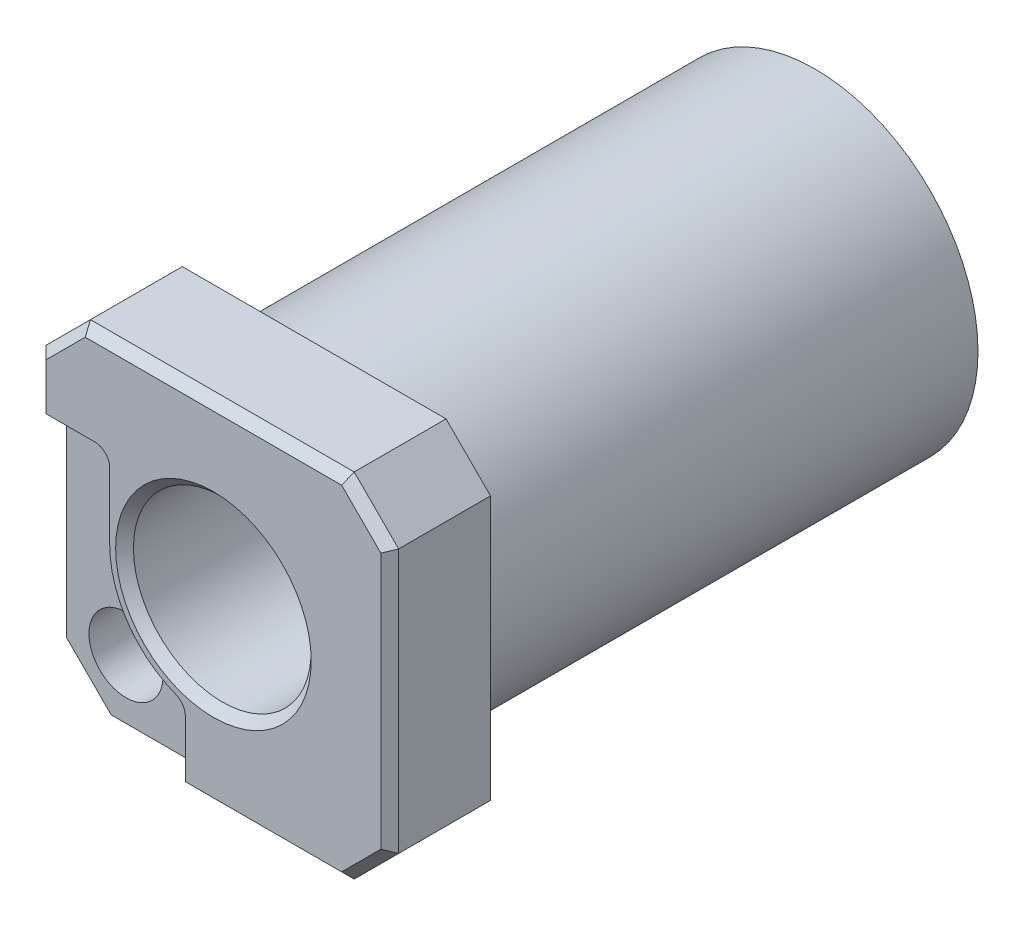
ISO-10303-21;
HEADER;
FILE_DESCRIPTION(('STEP AP214'),'2;1');
FILE_NAME('part.step','',(''),(''),'','','');
FILE_SCHEMA(('AUTOMOTIVE_DESIGN { 1 0 10303 214 1 1 1 1 }'));
ENDSEC;
DATA;
#1=APPLICATION_CONTEXT('core data for automotive mechanical design processes');
#2=APPLICATION_PROTOCOL_DEFINITION('international standard','automotive_design',2000,#1);
#3=PRODUCT_CONTEXT('',#1,'mechanical');
#4=PRODUCT('Part','Part','',(#3));
#5=PRODUCT_RELATED_PRODUCT_CATEGORY('part','',(#4));
#6=PRODUCT_DEFINITION_FORMATION('','',#4);
#7=PRODUCT_DEFINITION_CONTEXT('part definition',#1,'design');
#8=PRODUCT_DEFINITION('design','',#6,#7);
#9=PRODUCT_DEFINITION_SHAPE('','',#8);
#10=(LENGTH_UNIT() NAMED_UNIT(*) SI_UNIT(.MILLI.,.METRE.));
#11=(NAMED_UNIT(*) PLANE_ANGLE_UNIT() SI_UNIT($,.RADIAN.));
#12=(NAMED_UNIT(*) SI_UNIT($,.STERADIAN.) SOLID_ANGLE_UNIT());
#13=UNCERTAINTY_MEASURE_WITH_UNIT(LENGTH_MEASURE(1.E-05),#10,'distance_accuracy_value','');
#14=(GEOMETRIC_REPRESENTATION_CONTEXT(3) GLOBAL_UNCERTAINTY_ASSIGNED_CONTEXT((#13)) GLOBAL_UNIT_ASSIGNED_CONTEXT((#10,
#11,#12)) REPRESENTATION_CONTEXT('',''));
#15=CARTESIAN_POINT('',(0.,0.,0.));
#16=DIRECTION('',(0.,0.,1.));
#17=DIRECTION('',(1.,0.,0.));
#18=AXIS2_PLACEMENT_3D('',#15,#16,#17);
#19=CARTESIAN_POINT('',(0.,0.,0.));
#20=DIRECTION('',(0.,0.,-1.));
#21=DIRECTION('',(1.,0.,0.));
#22=AXIS2_PLACEMENT_3D('',#19,#20,#21);
#23=CYLINDRICAL_SURFACE('',#22,3.);
#24=CARTESIAN_POINT('',(0.,0.,3.1));
#25=DIRECTION('',(0.,0.,1.));
#26=DIRECTION('',(1.,0.,0.));
#27=AXIS2_PLACEMENT_3D('',#24,#25,#26);
#28=CIRCLE('',#27,3.);
#29=CARTESIAN_POINT('',(-3.,0.,3.1));
#30=VERTEX_POINT('',#29);
#31=EDGE_CURVE('E558',#30,#30,#28,.T.);
#32=ORIENTED_EDGE('',*,*,#31,.T.);
#33=DIRECTION('',(0.,0.,-1.));
#34=VECTOR('',#33,1.);
#35=CARTESIAN_POINT('',(-3.,0.,0.));
#36=LINE('',#35,#34);
#37=CARTESIAN_POINT('',(-3.,0.,-16.9));
#38=VERTEX_POINT('',#37);
#39=EDGE_CURVE('E11',#30,#38,#36,.T.);
#40=ORIENTED_EDGE('',*,*,#39,.T.);
#41=CARTESIAN_POINT('',(0.,0.,-16.9));
#42=DIRECTION('',(0.,0.,1.));
#43=DIRECTION('',(1.,0.,0.));
#44=AXIS2_PLACEMENT_3D('',#41,#42,#43);
#45=CIRCLE('',#44,3.);
#46=EDGE_CURVE('E28',#38,#38,#45,.T.);
#47=ORIENTED_EDGE('',*,*,#46,.F.);
#48=ORIENTED_EDGE('',*,*,#39,.F.);
#49=EDGE_LOOP('',(#32,#40,#47,#48));
#50=FACE_BOUND('',#49,.T.);
#51=ADVANCED_FACE('F17',(#50),#23,.F.);
#52=CARTESIAN_POINT('',(0.,0.,0.));
#53=DIRECTION('',(0.,0.,1.));
#54=DIRECTION('',(1.,0.,0.));
#55=AXIS2_PLACEMENT_3D('',#52,#53,#54);
#56=PLANE('',#55);
#57=CARTESIAN_POINT('',(-3.95,-3.95,0.));
#58=DIRECTION('',(0.,0.,1.));
#59=DIRECTION('',(1.,0.,0.));
#60=AXIS2_PLACEMENT_3D('',#57,#58,#59);
#61=CIRCLE('',#60,1.25);
#62=CARTESIAN_POINT('',(-2.921261188788,-4.660067925136,0.));
#63=VERTEX_POINT('',#62);
#64=CARTESIAN_POINT('',(-4.660067925136,-2.921261188788,0.));
#65=VERTEX_POINT('',#64);
#66=EDGE_CURVE('E328',#63,#65,#61,.T.);
#67=ORIENTED_EDGE('',*,*,#66,.T.);
#68=CARTESIAN_POINT('',(0.,0.,0.));
#69=DIRECTION('',(0.,0.,-1.));
#70=DIRECTION('',(1.,0.,0.));
#71=AXIS2_PLACEMENT_3D('',#68,#69,#70);
#72=CIRCLE('',#71,5.5);
#73=EDGE_CURVE('E273',#63,#65,#72,.T.);
#74=ORIENTED_EDGE('',*,*,#73,.F.);
#75=EDGE_LOOP('',(#67,#74));
#76=FACE_BOUND('',#75,.T.);
#77=ADVANCED_FACE('F735',(#76),#56,.T.);
#78=CARTESIAN_POINT('',(0.,0.,-16.9));
#79=DIRECTION('',(0.,0.,1.));
#80=DIRECTION('',(1.,0.,0.));
#81=AXIS2_PLACEMENT_3D('',#78,#79,#80);
#82=PLANE('',#81);
#83=ORIENTED_EDGE('',*,*,#46,.T.);
#84=EDGE_LOOP('',(#83));
#85=FACE_BOUND('',#84,.T.);
#86=CARTESIAN_POINT('',(0.,0.,-16.9));
#87=DIRECTION('',(0.,0.,1.));
#88=DIRECTION('',(1.,0.,0.));
#89=AXIS2_PLACEMENT_3D('',#86,#87,#88);
#90=CIRCLE('',#89,5.5);
#91=CARTESIAN_POINT('',(-5.5,0.,-16.9));
#92=VERTEX_POINT('',#91);
#93=EDGE_CURVE('E257',#92,#92,#90,.T.);
#94=ORIENTED_EDGE('',*,*,#93,.F.);
#95=EDGE_LOOP('',(#94));
#96=FACE_BOUND('',#95,.T.);
#97=ADVANCED_FACE('F740',(#85,#96),#82,.F.);
#98=CARTESIAN_POINT('',(0.,0.,3.1));
#99=DIRECTION('',(0.,0.,1.));
#100=DIRECTION('',(1.,0.,0.));
#101=AXIS2_PLACEMENT_3D('',#98,#99,#100);
#102=CONICAL_SURFACE('',#101,3.,0.785398163397);
#103=ORIENTED_EDGE('',*,*,#31,.F.);
#104=DIRECTION('',(-0.707106781186231,0.,0.707106781186865));
#105=VECTOR('',#104,1.);
#106=CARTESIAN_POINT('',(-3.,0.,3.1));
#107=LINE('',#106,#105);
#108=CARTESIAN_POINT('',(-3.29999999999987,0.,3.40000000000014));
#109=VERTEX_POINT('',#108);
#110=EDGE_CURVE('E440',#30,#109,#107,.T.);
#111=ORIENTED_EDGE('',*,*,#110,.T.);
#112=CARTESIAN_POINT('',(0.,0.,3.4));
#113=DIRECTION('',(0.,0.,1.));
#114=DIRECTION('',(1.,0.,0.));
#115=AXIS2_PLACEMENT_3D('',#112,#113,#114);
#116=CIRCLE('',#115,3.3);
#117=EDGE_CURVE('E459',#109,#109,#116,.T.);
#118=ORIENTED_EDGE('',*,*,#117,.T.);
#119=ORIENTED_EDGE('',*,*,#110,.F.);
#120=EDGE_LOOP('',(#103,#111,#118,#119));
#121=FACE_BOUND('',#120,.T.);
#122=ADVANCED_FACE('F826',(#121),#102,.F.);
#123=CARTESIAN_POINT('',(4.45,-5.8,3.25));
#124=DIRECTION('',(0.,-0.707106781186548,0.707106781186548));
#125=DIRECTION('',(-1.,0.,0.));
#126=AXIS2_PLACEMENT_3D('',#123,#124,#125);
#127=PLANE('',#126);
#128=DIRECTION('',(0.281084637714927,-0.678598344545825,-0.678598344545825));
#129=VECTOR('',#128,1.);
#130=CARTESIAN_POINT('',(4.308975681847,-5.609537178492,3.440462821508));
#131=LINE('',#130,#129);
#132=CARTESIAN_POINT('',(4.325735931288,-5.65,3.4));
#133=VERTEX_POINT('',#132);
#134=CARTESIAN_POINT('',(4.45,-5.95,3.1));
#135=VERTEX_POINT('',#134);
#136=EDGE_CURVE('E237',#133,#135,#131,.T.);
#137=ORIENTED_EDGE('',*,*,#136,.F.);
#138=DIRECTION('',(-1.,0.,0.));
#139=VECTOR('',#138,1.);
#140=CARTESIAN_POINT('',(4.45,-5.65,3.4));
#141=LINE('',#140,#139);
#142=CARTESIAN_POINT('',(-0.95,-5.65,3.4));
#143=VERTEX_POINT('',#142);
#144=EDGE_CURVE('E423',#133,#143,#141,.T.);
#145=ORIENTED_EDGE('',*,*,#144,.T.);
#146=DIRECTION('',(0.,-0.707106781186548,-0.707106781186548));
#147=VECTOR('',#146,1.);
#148=CARTESIAN_POINT('',(-0.95,-5.244483771318,3.805516228682));
#149=LINE('',#148,#147);
#150=CARTESIAN_POINT('',(-0.95,-5.95,3.1));
#151=VERTEX_POINT('',#150);
#152=EDGE_CURVE('E226',#143,#151,#149,.T.);
#153=ORIENTED_EDGE('',*,*,#152,.T.);
#154=DIRECTION('',(-1.,0.,0.));
#155=VECTOR('',#154,1.);
#156=CARTESIAN_POINT('',(4.45,-5.95,3.1));
#157=LINE('',#156,#155);
#158=EDGE_CURVE('E350',#135,#151,#157,.T.);
#159=ORIENTED_EDGE('',*,*,#158,.F.);
#160=EDGE_LOOP('',(#137,#145,#153,#159));
#161=FACE_BOUND('',#160,.T.);
#162=ADVANCED_FACE('F764',(#161),#127,.T.);
#163=CARTESIAN_POINT('',(5.843933982822,-4.343933982822,3.25));
#164=DIRECTION('',(0.49999999999984,-0.49999999999984,0.707106781186774));
#165=DIRECTION('',(-0.707106781186548,-0.707106781186548,0.));
#166=AXIS2_PLACEMENT_3D('',#163,#164,#165);
#167=PLANE('',#166);
#168=DIRECTION('',(0.678598344545825,-0.281084637714927,-0.678598344545825));
#169=VECTOR('',#168,1.);
#170=CARTESIAN_POINT('',(4.963042400288,-4.041188776712,4.086957599712));
#171=LINE('',#170,#169);
#172=CARTESIAN_POINT('',(5.65,-4.325735931288,3.4));
#173=VERTEX_POINT('',#172);
#174=CARTESIAN_POINT('',(5.95,-4.45,3.1));
#175=VERTEX_POINT('',#174);
#176=EDGE_CURVE('E435',#173,#175,#171,.T.);
#177=ORIENTED_EDGE('',*,*,#176,.F.);
#178=DIRECTION('',(-0.707106781186548,-0.707106781186548,0.));
#179=VECTOR('',#178,1.);
#180=CARTESIAN_POINT('',(5.737867965644,-4.237867965644,3.4));
#181=LINE('',#180,#179);
#182=EDGE_CURVE('E369',#173,#133,#181,.T.);
#183=ORIENTED_EDGE('',*,*,#182,.T.);
#184=ORIENTED_EDGE('',*,*,#136,.T.);
#185=DIRECTION('',(-0.707106781186548,-0.707106781186548,0.));
#186=VECTOR('',#185,1.);
#187=CARTESIAN_POINT('',(5.95,-4.45,3.1));
#188=LINE('',#187,#186);
#189=EDGE_CURVE('E374',#175,#135,#188,.T.);
#190=ORIENTED_EDGE('',*,*,#189,.F.);
#191=EDGE_LOOP('',(#177,#183,#184,#190));
#192=FACE_BOUND('',#191,.T.);
#193=ADVANCED_FACE('F758',(#192),#167,.T.);
#194=CARTESIAN_POINT('',(-0.95,-3.727935085272,3.4));
#195=DIRECTION('',(-1.,0.,0.));
#196=DIRECTION('',(0.,0.,1.));
#197=AXIS2_PLACEMENT_3D('',#194,#195,#196);
#198=PLANE('',#197);
#199=DIRECTION('',(0.,0.,-1.));
#200=VECTOR('',#199,1.);
#201=CARTESIAN_POINT('',(-0.95,-5.95,3.4));
#202=LINE('',#201,#200);
#203=CARTESIAN_POINT('',(-0.95,-5.95,2.4));
#204=VERTEX_POINT('',#203);
#205=EDGE_CURVE('E320',#151,#204,#202,.T.);
#206=ORIENTED_EDGE('',*,*,#205,.F.);
#207=ORIENTED_EDGE('',*,*,#152,.F.);
#208=DIRECTION('',(0.,-1.,0.));
#209=VECTOR('',#208,1.);
#210=CARTESIAN_POINT('',(-0.95,-3.727935085272,3.4));
#211=LINE('',#210,#209);
#212=CARTESIAN_POINT('',(-0.95,-3.727935085272,3.4));
#213=VERTEX_POINT('',#212);
#214=EDGE_CURVE('E426',#213,#143,#211,.T.);
#215=ORIENTED_EDGE('',*,*,#214,.F.);
#216=DIRECTION('',(0.,0.,-1.));
#217=VECTOR('',#216,1.);
#218=CARTESIAN_POINT('',(-0.95,-3.727935085272,3.4));
#219=LINE('',#218,#217);
#220=CARTESIAN_POINT('',(-0.95,-3.727935085272,2.4));
#221=VERTEX_POINT('',#220);
#222=EDGE_CURVE('E289',#213,#221,#219,.T.);
#223=ORIENTED_EDGE('',*,*,#222,.T.);
#224=DIRECTION('',(0.,-1.,0.));
#225=VECTOR('',#224,1.);
#226=CARTESIAN_POINT('',(-0.95,-3.727935085272,2.4));
#227=LINE('',#226,#225);
#228=EDGE_CURVE('E354',#221,#204,#227,.T.);
#229=ORIENTED_EDGE('',*,*,#228,.T.);
#230=EDGE_LOOP('',(#206,#207,#215,#223,#229));
#231=FACE_BOUND('',#230,.T.);
#232=ADVANCED_FACE('F763',(#231),#198,.T.);
#233=CARTESIAN_POINT('',(5.8,4.45,3.25));
#234=DIRECTION('',(0.707106781186548,0.,0.707106781186548));
#235=DIRECTION('',(0.,-1.,0.));
#236=AXIS2_PLACEMENT_3D('',#233,#234,#235);
#237=PLANE('',#236);
#238=DIRECTION('',(-0.678598344545825,-0.281084637714927,0.678598344545825));
#239=VECTOR('',#238,1.);
#240=CARTESIAN_POINT('',(5.609537178492,4.308975681847,3.440462821508));
#241=LINE('',#240,#239);
#242=CARTESIAN_POINT('',(5.95,4.45,3.1));
#243=VERTEX_POINT('',#242);
#244=CARTESIAN_POINT('',(5.65,4.325735931288,3.4));
#245=VERTEX_POINT('',#244);
#246=EDGE_CURVE('E465',#243,#245,#241,.T.);
#247=ORIENTED_EDGE('',*,*,#246,.T.);
#248=DIRECTION('',(0.,-1.,0.));
#249=VECTOR('',#248,1.);
#250=CARTESIAN_POINT('',(5.65,4.45,3.4));
#251=LINE('',#250,#249);
#252=EDGE_CURVE('E364',#245,#173,#251,.T.);
#253=ORIENTED_EDGE('',*,*,#252,.T.);
#254=ORIENTED_EDGE('',*,*,#176,.T.);
#255=DIRECTION('',(0.,-1.,0.));
#256=VECTOR('',#255,1.);
#257=CARTESIAN_POINT('',(5.95,4.45,3.1));
#258=LINE('',#257,#256);
#259=EDGE_CURVE('E325',#243,#175,#258,.T.);
#260=ORIENTED_EDGE('',*,*,#259,.F.);
#261=EDGE_LOOP('',(#247,#253,#254,#260));
#262=FACE_BOUND('',#261,.T.);
#263=ADVANCED_FACE('F845',(#262),#237,.T.);
#264=CARTESIAN_POINT('',(-1.45,-3.727935085272,3.4));
#265=DIRECTION('',(0.,0.,1.));
#266=DIRECTION('',(1.,0.,0.));
#267=AXIS2_PLACEMENT_3D('',#264,#265,#266);
#268=CYLINDRICAL_SURFACE('',#267,0.5);
#269=ORIENTED_EDGE('',*,*,#222,.F.);
#270=CARTESIAN_POINT('',(-1.45,-3.727935085272,3.4));
#271=DIRECTION('',(0.,0.,1.));
#272=DIRECTION('',(1.,0.,0.));
#273=AXIS2_PLACEMENT_3D('',#270,#271,#272);
#274=CIRCLE('',#273,0.5);
#275=CARTESIAN_POINT('',(-1.26875,-3.261943199613,3.4));
#276=VERTEX_POINT('',#275);
#277=EDGE_CURVE('E306',#213,#276,#274,.T.);
#278=ORIENTED_EDGE('',*,*,#277,.T.);
#279=DIRECTION('',(0.,0.,-1.));
#280=VECTOR('',#279,1.);
#281=CARTESIAN_POINT('',(-1.26875,-3.261943199613,3.4));
#282=LINE('',#281,#280);
#283=CARTESIAN_POINT('',(-1.26875,-3.261943199613,2.4));
#284=VERTEX_POINT('',#283);
#285=EDGE_CURVE('E563',#276,#284,#282,.T.);
#286=ORIENTED_EDGE('',*,*,#285,.T.);
#287=CARTESIAN_POINT('',(-1.45,-3.727935085272,2.4));
#288=DIRECTION('',(0.,0.,1.));
#289=DIRECTION('',(1.,0.,0.));
#290=AXIS2_PLACEMENT_3D('',#287,#288,#289);
#291=CIRCLE('',#290,0.5);
#292=EDGE_CURVE('E296',#221,#284,#291,.T.);
#293=ORIENTED_EDGE('',*,*,#292,.F.);
#294=EDGE_LOOP('',(#269,#278,#286,#293));
#295=FACE_BOUND('',#294,.T.);
#296=ADVANCED_FACE('F19',(#295),#268,.F.);
#297=CARTESIAN_POINT('',(0.,0.,3.4));
#298=DIRECTION('',(0.,0.,1.));
#299=DIRECTION('',(1.,0.,0.));
#300=AXIS2_PLACEMENT_3D('',#297,#298,#299);
#301=CYLINDRICAL_SURFACE('',#300,3.5);
#302=DIRECTION('',(0.,0.,-1.));
#303=VECTOR('',#302,1.);
#304=CARTESIAN_POINT('',(-3.5,0.,3.4));
#305=LINE('',#304,#303);
#306=CARTESIAN_POINT('',(-3.5,0.,3.4));
#307=VERTEX_POINT('',#306);
#308=CARTESIAN_POINT('',(-3.5,0.,2.4));
#309=VERTEX_POINT('',#308);
#310=EDGE_CURVE('E348',#307,#309,#305,.T.);
#311=ORIENTED_EDGE('',*,*,#310,.T.);
#312=CARTESIAN_POINT('',(0.,0.,2.4));
#313=DIRECTION('',(0.,0.,1.));
#314=DIRECTION('',(1.,0.,0.));
#315=AXIS2_PLACEMENT_3D('',#312,#313,#314);
#316=CIRCLE('',#315,3.5);
#317=EDGE_CURVE('E291',#309,#284,#316,.T.);
#318=ORIENTED_EDGE('',*,*,#317,.T.);
#319=ORIENTED_EDGE('',*,*,#285,.F.);
#320=CARTESIAN_POINT('',(0.,0.,3.4));
#321=DIRECTION('',(0.,0.,1.));
#322=DIRECTION('',(1.,0.,0.));
#323=AXIS2_PLACEMENT_3D('',#320,#321,#322);
#324=CIRCLE('',#323,3.5);
#325=EDGE_CURVE('E302',#307,#276,#324,.T.);
#326=ORIENTED_EDGE('',*,*,#325,.F.);
#327=EDGE_LOOP('',(#311,#318,#319,#326));
#328=FACE_BOUND('',#327,.T.);
#329=ADVANCED_FACE('F777',(#328),#301,.T.);
#330=CARTESIAN_POINT('',(-3.5,2.25,3.4));
#331=DIRECTION('',(-1.,0.,0.));
#332=DIRECTION('',(0.,0.,1.));
#333=AXIS2_PLACEMENT_3D('',#330,#331,#332);
#334=PLANE('',#333);
#335=DIRECTION('',(0.,0.,-1.));
#336=VECTOR('',#335,1.);
#337=CARTESIAN_POINT('',(-3.5,2.25,3.4));
#338=LINE('',#337,#336);
#339=CARTESIAN_POINT('',(-3.5,2.25,3.4));
#340=VERTEX_POINT('',#339);
#341=CARTESIAN_POINT('',(-3.5,2.25,2.4));
#342=VERTEX_POINT('',#341);
#343=EDGE_CURVE('E345',#340,#342,#338,.T.);
#344=ORIENTED_EDGE('',*,*,#343,.T.);
#345=DIRECTION('',(0.,-1.,0.));
#346=VECTOR('',#345,1.);
#347=CARTESIAN_POINT('',(-3.5,2.25,2.4));
#348=LINE('',#347,#346);
#349=EDGE_CURVE('E295',#342,#309,#348,.T.);
#350=ORIENTED_EDGE('',*,*,#349,.T.);
#351=ORIENTED_EDGE('',*,*,#310,.F.);
#352=DIRECTION('',(0.,-1.,0.));
#353=VECTOR('',#352,1.);
#354=CARTESIAN_POINT('',(-3.5,2.25,3.4));
#355=LINE('',#354,#353);
#356=EDGE_CURVE('E307',#340,#307,#355,.T.);
#357=ORIENTED_EDGE('',*,*,#356,.F.);
#358=EDGE_LOOP('',(#344,#350,#351,#357));
#359=FACE_BOUND('',#358,.T.);
#360=ADVANCED_FACE('F771',(#359),#334,.T.);
#361=CARTESIAN_POINT('',(-4.,2.25,3.4));
#362=DIRECTION('',(0.,0.,1.));
#363=DIRECTION('',(1.,0.,0.));
#364=AXIS2_PLACEMENT_3D('',#361,#362,#363);
#365=CYLINDRICAL_SURFACE('',#364,0.5);
#366=ORIENTED_EDGE('',*,*,#343,.F.);
#367=CARTESIAN_POINT('',(-4.,2.25,3.4));
#368=DIRECTION('',(0.,0.,1.));
#369=DIRECTION('',(1.,0.,0.));
#370=AXIS2_PLACEMENT_3D('',#367,#368,#369);
#371=CIRCLE('',#370,0.5);
#372=CARTESIAN_POINT('',(-4.,2.75,3.4));
#373=VERTEX_POINT('',#372);
#374=EDGE_CURVE('E308',#340,#373,#371,.T.);
#375=ORIENTED_EDGE('',*,*,#374,.T.);
#376=DIRECTION('',(0.,0.,-1.));
#377=VECTOR('',#376,1.);
#378=CARTESIAN_POINT('',(-4.,2.75,3.4));
#379=LINE('',#378,#377);
#380=CARTESIAN_POINT('',(-4.,2.75,2.4));
#381=VERTEX_POINT('',#380);
#382=EDGE_CURVE('E189',#373,#381,#379,.T.);
#383=ORIENTED_EDGE('',*,*,#382,.T.);
#384=CARTESIAN_POINT('',(-4.,2.25,2.4));
#385=DIRECTION('',(0.,0.,1.));
#386=DIRECTION('',(1.,0.,0.));
#387=AXIS2_PLACEMENT_3D('',#384,#385,#386);
#388=CIRCLE('',#387,0.5);
#389=EDGE_CURVE('E349',#342,#381,#388,.T.);
#390=ORIENTED_EDGE('',*,*,#389,.F.);
#391=EDGE_LOOP('',(#366,#375,#383,#390));
#392=FACE_BOUND('',#391,.T.);
#393=ADVANCED_FACE('F776',(#392),#365,.F.);
#394=CARTESIAN_POINT('',(-4.028350418133,-2.114058066306,2.4));
#395=DIRECTION('',(0.,0.,1.));
#396=DIRECTION('',(1.,0.,0.));
#397=AXIS2_PLACEMENT_3D('',#394,#395,#396);
#398=PLANE('',#397);
#399=CARTESIAN_POINT('',(-3.95,-3.95,2.4));
#400=DIRECTION('',(0.,0.,1.));
#401=DIRECTION('',(1.,0.,0.));
#402=AXIS2_PLACEMENT_3D('',#399,#400,#401);
#403=CIRCLE('',#402,1.25);
#404=CARTESIAN_POINT('',(-5.2,-3.95,2.4));
#405=VERTEX_POINT('',#404);
#406=EDGE_CURVE('E344',#405,#405,#403,.T.);
#407=ORIENTED_EDGE('',*,*,#406,.F.);
#408=EDGE_LOOP('',(#407));
#409=FACE_BOUND('',#408,.T.);
#410=DIRECTION('',(-1.,0.,0.));
#411=VECTOR('',#410,1.);
#412=CARTESIAN_POINT('',(-0.95,-5.95,2.4));
#413=LINE('',#412,#411);
#414=CARTESIAN_POINT('',(-4.45,-5.95,2.4));
#415=VERTEX_POINT('',#414);
#416=EDGE_CURVE('E259',#204,#415,#413,.T.);
#417=ORIENTED_EDGE('',*,*,#416,.F.);
#418=ORIENTED_EDGE('',*,*,#228,.F.);
#419=ORIENTED_EDGE('',*,*,#292,.T.);
#420=ORIENTED_EDGE('',*,*,#317,.F.);
#421=ORIENTED_EDGE('',*,*,#349,.F.);
#422=ORIENTED_EDGE('',*,*,#389,.T.);
#423=DIRECTION('',(1.,0.,0.));
#424=VECTOR('',#423,1.);
#425=CARTESIAN_POINT('',(-5.95,2.75,2.4));
#426=LINE('',#425,#424);
#427=CARTESIAN_POINT('',(-5.95,2.75,2.4));
#428=VERTEX_POINT('',#427);
#429=EDGE_CURVE('E382',#428,#381,#426,.T.);
#430=ORIENTED_EDGE('',*,*,#429,.F.);
#431=DIRECTION('',(0.,1.,0.));
#432=VECTOR('',#431,1.);
#433=CARTESIAN_POINT('',(-5.95,-5.95,2.4));
#434=LINE('',#433,#432);
#435=CARTESIAN_POINT('',(-5.95,-4.45,2.4));
#436=VERTEX_POINT('',#435);
#437=EDGE_CURVE('E329',#436,#428,#434,.T.);
#438=ORIENTED_EDGE('',*,*,#437,.F.);
#439=DIRECTION('',(0.707106781186548,-0.707106781186548,0.));
#440=VECTOR('',#439,1.);
#441=CARTESIAN_POINT('',(-5.678573087957,-4.721426912043,2.4));
#442=LINE('',#441,#440);
#443=EDGE_CURVE('E370',#436,#415,#442,.T.);
#444=ORIENTED_EDGE('',*,*,#443,.T.);
#445=EDGE_LOOP('',(#417,#418,#419,#420,#421,#422,#430,#438,#444));
#446=FACE_BOUND('',#445,.T.);
#447=ADVANCED_FACE('F837',(#409,#446),#398,.T.);
#448=CARTESIAN_POINT('',(-5.95,2.75,3.4));
#449=DIRECTION('',(0.,-1.,0.));
#450=DIRECTION('',(0.,0.,-1.));
#451=AXIS2_PLACEMENT_3D('',#448,#449,#450);
#452=PLANE('',#451);
#453=DIRECTION('',(0.,0.,-1.));
#454=VECTOR('',#453,1.);
#455=CARTESIAN_POINT('',(-5.95,2.75,3.4));
#456=LINE('',#455,#454);
#457=CARTESIAN_POINT('',(-5.95,2.75,3.1));
#458=VERTEX_POINT('',#457);
#459=EDGE_CURVE('E333',#458,#428,#456,.T.);
#460=ORIENTED_EDGE('',*,*,#459,.T.);
#461=ORIENTED_EDGE('',*,*,#429,.T.);
#462=ORIENTED_EDGE('',*,*,#382,.F.);
#463=DIRECTION('',(1.,0.,0.));
#464=VECTOR('',#463,1.);
#465=CARTESIAN_POINT('',(-5.95,2.75,3.4));
#466=LINE('',#465,#464);
#467=CARTESIAN_POINT('',(-5.65,2.75,3.4));
#468=VERTEX_POINT('',#467);
#469=EDGE_CURVE('E311',#468,#373,#466,.T.);
#470=ORIENTED_EDGE('',*,*,#469,.F.);
#471=DIRECTION('',(-0.707106781186548,0.,-0.707106781186548));
#472=VECTOR('',#471,1.);
#473=CARTESIAN_POINT('',(-5.8,2.75,3.25));
#474=LINE('',#473,#472);
#475=EDGE_CURVE('E200',#468,#458,#474,.T.);
#476=ORIENTED_EDGE('',*,*,#475,.T.);
#477=EDGE_LOOP('',(#460,#461,#462,#470,#476));
#478=FACE_BOUND('',#477,.T.);
#479=ADVANCED_FACE('F832',(#478),#452,.T.);
#480=CARTESIAN_POINT('',(-5.8,2.75,3.25));
#481=DIRECTION('',(-0.707106781186548,0.,0.707106781186548));
#482=DIRECTION('',(0.,1.,0.));
#483=AXIS2_PLACEMENT_3D('',#480,#481,#482);
#484=PLANE('',#483);
#485=ORIENTED_EDGE('',*,*,#475,.F.);
#486=DIRECTION('',(0.,1.,0.));
#487=VECTOR('',#486,1.);
#488=CARTESIAN_POINT('',(-5.65,2.75,3.4));
#489=LINE('',#488,#487);
#490=CARTESIAN_POINT('',(-5.65,4.325735931288,3.4));
#491=VERTEX_POINT('',#490);
#492=EDGE_CURVE('E407',#468,#491,#489,.T.);
#493=ORIENTED_EDGE('',*,*,#492,.T.);
#494=DIRECTION('',(-0.678598344545825,0.281084637714927,-0.678598344545825));
#495=VECTOR('',#494,1.);
#496=CARTESIAN_POINT('',(-5.447405144136,4.241818394322,3.602594855864));
#497=LINE('',#496,#495);
#498=CARTESIAN_POINT('',(-5.95,4.45,3.1));
#499=VERTEX_POINT('',#498);
#500=EDGE_CURVE('E381',#491,#499,#497,.T.);
#501=ORIENTED_EDGE('',*,*,#500,.T.);
#502=DIRECTION('',(0.,1.,0.));
#503=VECTOR('',#502,1.);
#504=CARTESIAN_POINT('',(-5.95,2.75,3.1));
#505=LINE('',#504,#503);
#506=EDGE_CURVE('E390',#458,#499,#505,.T.);
#507=ORIENTED_EDGE('',*,*,#506,.F.);
#508=EDGE_LOOP('',(#485,#493,#501,#507));
#509=FACE_BOUND('',#508,.T.);
#510=ADVANCED_FACE('F456',(#509),#484,.T.);
#511=CARTESIAN_POINT('',(-3.95,-3.95,2.4));
#512=DIRECTION('',(0.,0.,1.));
#513=DIRECTION('',(1.,0.,0.));
#514=AXIS2_PLACEMENT_3D('',#511,#512,#513);
#515=CYLINDRICAL_SURFACE('',#514,1.25);
#516=ORIENTED_EDGE('',*,*,#66,.F.);
#517=CARTESIAN_POINT('',(-3.95,-3.95,0.));
#518=DIRECTION('',(0.,0.,1.));
#519=DIRECTION('',(1.,0.,0.));
#520=AXIS2_PLACEMENT_3D('',#517,#518,#519);
#521=CIRCLE('',#520,1.25);
#522=CARTESIAN_POINT('',(-5.2,-3.95,0.));
#523=VERTEX_POINT('',#522);
#524=EDGE_CURVE('E268',#523,#63,#521,.T.);
#525=ORIENTED_EDGE('',*,*,#524,.F.);
#526=DIRECTION('',(0.,0.,1.));
#527=VECTOR('',#526,1.);
#528=CARTESIAN_POINT('',(-5.2,-3.95,2.4));
#529=LINE('',#528,#527);
#530=EDGE_CURVE('E340',#523,#405,#529,.T.);
#531=ORIENTED_EDGE('',*,*,#530,.T.);
#532=ORIENTED_EDGE('',*,*,#406,.T.);
#533=ORIENTED_EDGE('',*,*,#530,.F.);
#534=CARTESIAN_POINT('',(-3.95,-3.95,0.));
#535=DIRECTION('',(0.,0.,1.));
#536=DIRECTION('',(1.,0.,0.));
#537=AXIS2_PLACEMENT_3D('',#534,#535,#536);
#538=CIRCLE('',#537,1.25);
#539=EDGE_CURVE('E276',#65,#523,#538,.T.);
#540=ORIENTED_EDGE('',*,*,#539,.F.);
#541=EDGE_LOOP('',(#516,#525,#531,#532,#533,#540));
#542=FACE_BOUND('',#541,.T.);
#543=ADVANCED_FACE('F747',(#542),#515,.F.);
#544=CARTESIAN_POINT('',(0.,0.,0.));
#545=DIRECTION('',(0.,0.,1.));
#546=DIRECTION('',(1.,0.,0.));
#547=AXIS2_PLACEMENT_3D('',#544,#545,#546);
#548=CYLINDRICAL_SURFACE('',#547,5.5);
#549=CARTESIAN_POINT('',(0.,0.,0.));
#550=DIRECTION('',(0.,0.,-1.));
#551=DIRECTION('',(1.,0.,0.));
#552=AXIS2_PLACEMENT_3D('',#549,#550,#551);
#553=CIRCLE('',#552,5.5);
#554=CARTESIAN_POINT('',(-5.5,0.,0.));
#555=VERTEX_POINT('',#554);
#556=EDGE_CURVE('E266',#65,#555,#553,.T.);
#557=ORIENTED_EDGE('',*,*,#556,.T.);
#558=DIRECTION('',(0.,0.,-1.));
#559=VECTOR('',#558,1.);
#560=CARTESIAN_POINT('',(-5.5,0.,0.));
#561=LINE('',#560,#559);
#562=EDGE_CURVE('E249',#555,#92,#561,.T.);
#563=ORIENTED_EDGE('',*,*,#562,.T.);
#564=ORIENTED_EDGE('',*,*,#93,.T.);
#565=ORIENTED_EDGE('',*,*,#562,.F.);
#566=CARTESIAN_POINT('',(0.,0.,0.));
#567=DIRECTION('',(0.,0.,-1.));
#568=DIRECTION('',(1.,0.,0.));
#569=AXIS2_PLACEMENT_3D('',#566,#567,#568);
#570=CIRCLE('',#569,5.5);
#571=EDGE_CURVE('E254',#555,#63,#570,.T.);
#572=ORIENTED_EDGE('',*,*,#571,.T.);
#573=ORIENTED_EDGE('',*,*,#73,.T.);
#574=EDGE_LOOP('',(#557,#563,#564,#565,#572,#573));
#575=FACE_BOUND('',#574,.T.);
#576=ADVANCED_FACE('F252',(#575),#548,.T.);
#577=CARTESIAN_POINT('',(5.95,-5.95,0.));
#578=DIRECTION('',(0.,-1.,0.));
#579=DIRECTION('',(0.,0.,-1.));
#580=AXIS2_PLACEMENT_3D('',#577,#578,#579);
#581=PLANE('',#580);
#582=DIRECTION('',(0.,0.,1.));
#583=VECTOR('',#582,1.);
#584=CARTESIAN_POINT('',(4.45,-5.95,0.));
#585=LINE('',#584,#583);
#586=CARTESIAN_POINT('',(4.45,-5.95,0.));
#587=VERTEX_POINT('',#586);
#588=EDGE_CURVE('E179',#587,#135,#585,.T.);
#589=ORIENTED_EDGE('',*,*,#588,.T.);
#590=ORIENTED_EDGE('',*,*,#158,.T.);
#591=ORIENTED_EDGE('',*,*,#205,.T.);
#592=ORIENTED_EDGE('',*,*,#416,.T.);
#593=DIRECTION('',(0.,0.,1.));
#594=VECTOR('',#593,1.);
#595=CARTESIAN_POINT('',(-4.45,-5.95,0.));
#596=LINE('',#595,#594);
#597=CARTESIAN_POINT('',(-4.45,-5.95,0.));
#598=VERTEX_POINT('',#597);
#599=EDGE_CURVE('E167',#598,#415,#596,.T.);
#600=ORIENTED_EDGE('',*,*,#599,.F.);
#601=DIRECTION('',(-1.,0.,0.));
#602=VECTOR('',#601,1.);
#603=CARTESIAN_POINT('',(5.95,-5.95,0.));
#604=LINE('',#603,#602);
#605=EDGE_CURVE('E402',#587,#598,#604,.T.);
#606=ORIENTED_EDGE('',*,*,#605,.F.);
#607=EDGE_LOOP('',(#589,#590,#591,#592,#600,#606));
#608=FACE_BOUND('',#607,.T.);
#609=ADVANCED_FACE('F807',(#608),#581,.T.);
#610=CARTESIAN_POINT('',(5.2,-5.2,0.));
#611=DIRECTION('',(0.707106781186548,-0.707106781186548,0.));
#612=DIRECTION('',(0.,0.,-1.));
#613=AXIS2_PLACEMENT_3D('',#610,#611,#612);
#614=PLANE('',#613);
#615=DIRECTION('',(0.,0.,1.));
#616=VECTOR('',#615,1.);
#617=CARTESIAN_POINT('',(5.95,-4.45,0.));
#618=LINE('',#617,#616);
#619=CARTESIAN_POINT('',(5.95,-4.45,0.));
#620=VERTEX_POINT('',#619);
#621=EDGE_CURVE('E321',#620,#175,#618,.T.);
#622=ORIENTED_EDGE('',*,*,#621,.T.);
#623=ORIENTED_EDGE('',*,*,#189,.T.);
#624=ORIENTED_EDGE('',*,*,#588,.F.);
#625=DIRECTION('',(-0.707106781186548,-0.707106781186548,0.));
#626=VECTOR('',#625,1.);
#627=CARTESIAN_POINT('',(5.2,-5.2,0.));
#628=LINE('',#627,#626);
#629=EDGE_CURVE('E398',#620,#587,#628,.T.);
#630=ORIENTED_EDGE('',*,*,#629,.F.);
#631=EDGE_LOOP('',(#622,#623,#624,#630));
#632=FACE_BOUND('',#631,.T.);
#633=ADVANCED_FACE('F790',(#632),#614,.T.);
#634=CARTESIAN_POINT('',(-5.2,-5.2,0.));
#635=DIRECTION('',(-0.707106781186548,-0.707106781186548,0.));
#636=DIRECTION('',(-0.707106781186548,0.707106781186548,0.));
#637=AXIS2_PLACEMENT_3D('',#634,#635,#636);
#638=PLANE('',#637);
#639=DIRECTION('',(0.707106781186548,-0.707106781186548,0.));
#640=VECTOR('',#639,1.);
#641=CARTESIAN_POINT('',(-5.2,-5.2,0.));
#642=LINE('',#641,#640);
#643=CARTESIAN_POINT('',(-5.95,-4.45,0.));
#644=VERTEX_POINT('',#643);
#645=EDGE_CURVE('E285',#644,#598,#642,.T.);
#646=ORIENTED_EDGE('',*,*,#645,.T.);
#647=ORIENTED_EDGE('',*,*,#599,.T.);
#648=ORIENTED_EDGE('',*,*,#443,.F.);
#649=DIRECTION('',(0.,0.,1.));
#650=VECTOR('',#649,1.);
#651=CARTESIAN_POINT('',(-5.95,-4.45,0.));
#652=LINE('',#651,#650);
#653=EDGE_CURVE('E334',#644,#436,#652,.T.);
#654=ORIENTED_EDGE('',*,*,#653,.F.);
#655=EDGE_LOOP('',(#646,#647,#648,#654));
#656=FACE_BOUND('',#655,.T.);
#657=ADVANCED_FACE('F784',(#656),#638,.T.);
#658=CARTESIAN_POINT('',(5.95,5.95,0.));
#659=DIRECTION('',(1.,0.,0.));
#660=DIRECTION('',(0.,1.,0.));
#661=AXIS2_PLACEMENT_3D('',#658,#659,#660);
#662=PLANE('',#661);
#663=DIRECTION('',(0.,0.,1.));
#664=VECTOR('',#663,1.);
#665=CARTESIAN_POINT('',(5.95,4.45,0.));
#666=LINE('',#665,#664);
#667=CARTESIAN_POINT('',(5.95,4.45,0.));
#668=VERTEX_POINT('',#667);
#669=EDGE_CURVE('E377',#668,#243,#666,.T.);
#670=ORIENTED_EDGE('',*,*,#669,.T.);
#671=ORIENTED_EDGE('',*,*,#259,.T.);
#672=ORIENTED_EDGE('',*,*,#621,.F.);
#673=DIRECTION('',(0.,-1.,0.));
#674=VECTOR('',#673,1.);
#675=CARTESIAN_POINT('',(5.95,5.95,0.));
#676=LINE('',#675,#674);
#677=EDGE_CURVE('E403',#668,#620,#676,.T.);
#678=ORIENTED_EDGE('',*,*,#677,.F.);
#679=EDGE_LOOP('',(#670,#671,#672,#678));
#680=FACE_BOUND('',#679,.T.);
#681=ADVANCED_FACE('F789',(#680),#662,.T.);
#682=CARTESIAN_POINT('',(4.343933982822,5.843933982822,3.25));
#683=DIRECTION('',(0.49999999999984,0.49999999999984,0.707106781186774));
#684=DIRECTION('',(0.707106781186548,-0.707106781186548,0.));
#685=AXIS2_PLACEMENT_3D('',#682,#683,#684);
#686=PLANE('',#685);
#687=DIRECTION('',(-0.281084637714927,-0.678598344545825,0.678598344545825));
#688=VECTOR('',#687,1.);
#689=CARTESIAN_POINT('',(4.041188776712,4.963042400288,4.086957599712));
#690=LINE('',#689,#688);
#691=CARTESIAN_POINT('',(4.45,5.95,3.1));
#692=VERTEX_POINT('',#691);
#693=CARTESIAN_POINT('',(4.325735931288,5.65,3.4));
#694=VERTEX_POINT('',#693);
#695=EDGE_CURVE('E21',#692,#694,#690,.T.);
#696=ORIENTED_EDGE('',*,*,#695,.T.);
#697=DIRECTION('',(0.707106781186548,-0.707106781186548,0.));
#698=VECTOR('',#697,1.);
#699=CARTESIAN_POINT('',(4.237867965644,5.737867965644,3.4));
#700=LINE('',#699,#698);
#701=EDGE_CURVE('E368',#694,#245,#700,.T.);
#702=ORIENTED_EDGE('',*,*,#701,.T.);
#703=ORIENTED_EDGE('',*,*,#246,.F.);
#704=DIRECTION('',(0.707106781186548,-0.707106781186548,0.));
#705=VECTOR('',#704,1.);
#706=CARTESIAN_POINT('',(4.45,5.95,3.1));
#707=LINE('',#706,#705);
#708=EDGE_CURVE('E270',#692,#243,#707,.T.);
#709=ORIENTED_EDGE('',*,*,#708,.F.);
#710=EDGE_LOOP('',(#696,#702,#703,#709));
#711=FACE_BOUND('',#710,.T.);
#712=ADVANCED_FACE('F801',(#711),#686,.T.);
#713=CARTESIAN_POINT('',(0.,0.,3.4));
#714=DIRECTION('',(0.,0.,1.));
#715=DIRECTION('',(1.,0.,0.));
#716=AXIS2_PLACEMENT_3D('',#713,#714,#715);
#717=PLANE('',#716);
#718=ORIENTED_EDGE('',*,*,#117,.F.);
#719=EDGE_LOOP('',(#718));
#720=FACE_BOUND('',#719,.T.);
#721=ORIENTED_EDGE('',*,*,#469,.T.);
#722=ORIENTED_EDGE('',*,*,#374,.F.);
#723=ORIENTED_EDGE('',*,*,#356,.T.);
#724=ORIENTED_EDGE('',*,*,#325,.T.);
#725=ORIENTED_EDGE('',*,*,#277,.F.);
#726=ORIENTED_EDGE('',*,*,#214,.T.);
#727=ORIENTED_EDGE('',*,*,#144,.F.);
#728=ORIENTED_EDGE('',*,*,#182,.F.);
#729=ORIENTED_EDGE('',*,*,#252,.F.);
#730=ORIENTED_EDGE('',*,*,#701,.F.);
#731=DIRECTION('',(1.,0.,0.));
#732=VECTOR('',#731,1.);
#733=CARTESIAN_POINT('',(-4.45,5.65,3.4));
#734=LINE('',#733,#732);
#735=CARTESIAN_POINT('',(-4.325735931288,5.65,3.4));
#736=VERTEX_POINT('',#735);
#737=EDGE_CURVE('E339',#736,#694,#734,.T.);
#738=ORIENTED_EDGE('',*,*,#737,.F.);
#739=DIRECTION('',(-0.707106781186548,-0.707106781186548,0.));
#740=VECTOR('',#739,1.);
#741=CARTESIAN_POINT('',(-4.237867965644,5.737867965644,3.4));
#742=LINE('',#741,#740);
#743=EDGE_CURVE('E422',#736,#491,#742,.T.);
#744=ORIENTED_EDGE('',*,*,#743,.T.);
#745=ORIENTED_EDGE('',*,*,#492,.F.);
#746=EDGE_LOOP('',(#721,#722,#723,#724,#725,#726,#727,#728,#729,#730,#738,#744,#745));
#747=FACE_BOUND('',#746,.T.);
#748=ADVANCED_FACE('F451',(#720,#747),#717,.T.);
#749=CARTESIAN_POINT('',(-5.95,-5.95,0.));
#750=DIRECTION('',(-1.,0.,0.));
#751=DIRECTION('',(0.,0.,1.));
#752=AXIS2_PLACEMENT_3D('',#749,#750,#751);
#753=PLANE('',#752);
#754=DIRECTION('',(0.,0.,1.));
#755=VECTOR('',#754,1.);
#756=CARTESIAN_POINT('',(-5.95,4.45,0.));
#757=LINE('',#756,#755);
#758=CARTESIAN_POINT('',(-5.95,4.45,0.));
#759=VERTEX_POINT('',#758);
#760=EDGE_CURVE('E312',#759,#499,#757,.T.);
#761=ORIENTED_EDGE('',*,*,#760,.F.);
#762=DIRECTION('',(0.,1.,0.));
#763=VECTOR('',#762,1.);
#764=CARTESIAN_POINT('',(-5.95,-5.95,0.));
#765=LINE('',#764,#763);
#766=EDGE_CURVE('E277',#644,#759,#765,.T.);
#767=ORIENTED_EDGE('',*,*,#766,.F.);
#768=ORIENTED_EDGE('',*,*,#653,.T.);
#769=ORIENTED_EDGE('',*,*,#437,.T.);
#770=ORIENTED_EDGE('',*,*,#459,.F.);
#771=ORIENTED_EDGE('',*,*,#506,.T.);
#772=EDGE_LOOP('',(#761,#767,#768,#769,#770,#771));
#773=FACE_BOUND('',#772,.T.);
#774=ADVANCED_FACE('F729',(#773),#753,.T.);
#775=CARTESIAN_POINT('',(-4.343933982822,5.843933982822,3.25));
#776=DIRECTION('',(0.49999999999984,-0.49999999999984,-0.707106781186774));
#777=DIRECTION('',(0.,-0.8164965809279,0.577350269189379));
#778=AXIS2_PLACEMENT_3D('',#775,#776,#777);
#779=PLANE('',#778);
#780=DIRECTION('',(0.281084637714927,-0.678598344545825,0.678598344545825));
#781=VECTOR('',#780,1.);
#782=CARTESIAN_POINT('',(-4.392776929051,5.811851286034,3.238148713966));
#783=LINE('',#782,#781);
#784=CARTESIAN_POINT('',(-4.45,5.95,3.1));
#785=VERTEX_POINT('',#784);
#786=EDGE_CURVE('E335',#785,#736,#783,.T.);
#787=ORIENTED_EDGE('',*,*,#786,.F.);
#788=DIRECTION('',(-0.707106781186548,-0.707106781186548,0.));
#789=VECTOR('',#788,1.);
#790=CARTESIAN_POINT('',(-4.45,5.95,3.1));
#791=LINE('',#790,#789);
#792=EDGE_CURVE('E316',#785,#499,#791,.T.);
#793=ORIENTED_EDGE('',*,*,#792,.T.);
#794=ORIENTED_EDGE('',*,*,#500,.F.);
#795=ORIENTED_EDGE('',*,*,#743,.F.);
#796=EDGE_LOOP('',(#787,#793,#794,#795));
#797=FACE_BOUND('',#796,.T.);
#798=ADVANCED_FACE('F454',(#797),#779,.F.);
#799=CARTESIAN_POINT('',(5.2,5.2,0.));
#800=DIRECTION('',(0.707106781186548,0.707106781186548,0.));
#801=DIRECTION('',(0.,0.,-1.));
#802=AXIS2_PLACEMENT_3D('',#799,#800,#801);
#803=PLANE('',#802);
#804=DIRECTION('',(0.,0.,1.));
#805=VECTOR('',#804,1.);
#806=CARTESIAN_POINT('',(4.45,5.95,0.));
#807=LINE('',#806,#805);
#808=CARTESIAN_POINT('',(4.45,5.95,0.));
#809=VERTEX_POINT('',#808);
#810=EDGE_CURVE('E576',#809,#692,#807,.T.);
#811=ORIENTED_EDGE('',*,*,#810,.T.);
#812=ORIENTED_EDGE('',*,*,#708,.T.);
#813=ORIENTED_EDGE('',*,*,#669,.F.);
#814=DIRECTION('',(0.707106781186548,-0.707106781186548,0.));
#815=VECTOR('',#814,1.);
#816=CARTESIAN_POINT('',(5.2,5.2,0.));
#817=LINE('',#816,#815);
#818=EDGE_CURVE('E443',#809,#668,#817,.T.);
#819=ORIENTED_EDGE('',*,*,#818,.F.);
#820=EDGE_LOOP('',(#811,#812,#813,#819));
#821=FACE_BOUND('',#820,.T.);
#822=ADVANCED_FACE('F728',(#821),#803,.T.);
#823=CARTESIAN_POINT('',(0.,0.,0.));
#824=DIRECTION('',(0.,0.,1.));
#825=DIRECTION('',(1.,0.,0.));
#826=AXIS2_PLACEMENT_3D('',#823,#824,#825);
#827=PLANE('',#826);
#828=ORIENTED_EDGE('',*,*,#556,.F.);
#829=ORIENTED_EDGE('',*,*,#539,.T.);
#830=ORIENTED_EDGE('',*,*,#524,.T.);
#831=ORIENTED_EDGE('',*,*,#571,.F.);
#832=EDGE_LOOP('',(#828,#829,#830,#831));
#833=FACE_BOUND('',#832,.T.);
#834=DIRECTION('',(1.,0.,0.));
#835=VECTOR('',#834,1.);
#836=CARTESIAN_POINT('',(-5.95,5.95,0.));
#837=LINE('',#836,#835);
#838=CARTESIAN_POINT('',(-4.45,5.95,0.));
#839=VERTEX_POINT('',#838);
#840=EDGE_CURVE('E363',#839,#809,#837,.T.);
#841=ORIENTED_EDGE('',*,*,#840,.T.);
#842=ORIENTED_EDGE('',*,*,#818,.T.);
#843=ORIENTED_EDGE('',*,*,#677,.T.);
#844=ORIENTED_EDGE('',*,*,#629,.T.);
#845=ORIENTED_EDGE('',*,*,#605,.T.);
#846=ORIENTED_EDGE('',*,*,#645,.F.);
#847=ORIENTED_EDGE('',*,*,#766,.T.);
#848=DIRECTION('',(-0.707106781186548,-0.707106781186548,0.));
#849=VECTOR('',#848,1.);
#850=CARTESIAN_POINT('',(-5.2,5.2,0.));
#851=LINE('',#850,#849);
#852=EDGE_CURVE('E317',#839,#759,#851,.T.);
#853=ORIENTED_EDGE('',*,*,#852,.F.);
#854=EDGE_LOOP('',(#841,#842,#843,#844,#845,#846,#847,#853));
#855=FACE_BOUND('',#854,.T.);
#856=ADVANCED_FACE('F263',(#833,#855),#827,.F.);
#857=CARTESIAN_POINT('',(-4.45,5.8,3.25));
#858=DIRECTION('',(0.,0.707106781186548,0.707106781186548));
#859=DIRECTION('',(1.,0.,0.));
#860=AXIS2_PLACEMENT_3D('',#857,#858,#859);
#861=PLANE('',#860);
#862=ORIENTED_EDGE('',*,*,#786,.T.);
#863=ORIENTED_EDGE('',*,*,#737,.T.);
#864=ORIENTED_EDGE('',*,*,#695,.F.);
#865=DIRECTION('',(1.,0.,0.));
#866=VECTOR('',#865,1.);
#867=CARTESIAN_POINT('',(-4.45,5.95,3.1));
#868=LINE('',#867,#866);
#869=EDGE_CURVE('E301',#785,#692,#868,.T.);
#870=ORIENTED_EDGE('',*,*,#869,.F.);
#871=EDGE_LOOP('',(#862,#863,#864,#870));
#872=FACE_BOUND('',#871,.T.);
#873=ADVANCED_FACE('F718',(#872),#861,.T.);
#874=CARTESIAN_POINT('',(-5.2,5.2,0.));
#875=DIRECTION('',(-0.707106781186548,0.707106781186548,0.));
#876=DIRECTION('',(0.,0.,1.));
#877=AXIS2_PLACEMENT_3D('',#874,#875,#876);
#878=PLANE('',#877);
#879=DIRECTION('',(0.,0.,1.));
#880=VECTOR('',#879,1.);
#881=CARTESIAN_POINT('',(-4.45,5.95,0.));
#882=LINE('',#881,#880);
#883=EDGE_CURVE('E297',#839,#785,#882,.T.);
#884=ORIENTED_EDGE('',*,*,#883,.F.);
#885=ORIENTED_EDGE('',*,*,#852,.T.);
#886=ORIENTED_EDGE('',*,*,#760,.T.);
#887=ORIENTED_EDGE('',*,*,#792,.F.);
#888=EDGE_LOOP('',(#884,#885,#886,#887));
#889=FACE_BOUND('',#888,.T.);
#890=ADVANCED_FACE('F712',(#889),#878,.T.);
#891=CARTESIAN_POINT('',(-5.95,5.95,0.));
#892=DIRECTION('',(0.,1.,0.));
#893=DIRECTION('',(1.,0.,0.));
#894=AXIS2_PLACEMENT_3D('',#891,#892,#893);
#895=PLANE('',#894);
#896=ORIENTED_EDGE('',*,*,#883,.T.);
#897=ORIENTED_EDGE('',*,*,#869,.T.);
#898=ORIENTED_EDGE('',*,*,#810,.F.);
#899=ORIENTED_EDGE('',*,*,#840,.F.);
#900=EDGE_LOOP('',(#896,#897,#898,#899));
#901=FACE_BOUND('',#900,.T.);
#902=ADVANCED_FACE('F717',(#901),#895,.T.);
#903=CLOSED_SHELL('',(#51,#77,#97,#122,#162,#193,#232,#263,#296,#329,#360,#393,#447,#479,#510,
#543,#576,#609,#633,#657,#681,#712,#748,#774,#798,#822,#856,#873,#890,#902));
#904=MANIFOLD_SOLID_BREP('B1',#903);
#905=ADVANCED_BREP_SHAPE_REPRESENTATION('',(#18,#904),#14);
#906=SHAPE_DEFINITION_REPRESENTATION(#9,#905);
ENDSEC;
END-ISO-10303-21;
